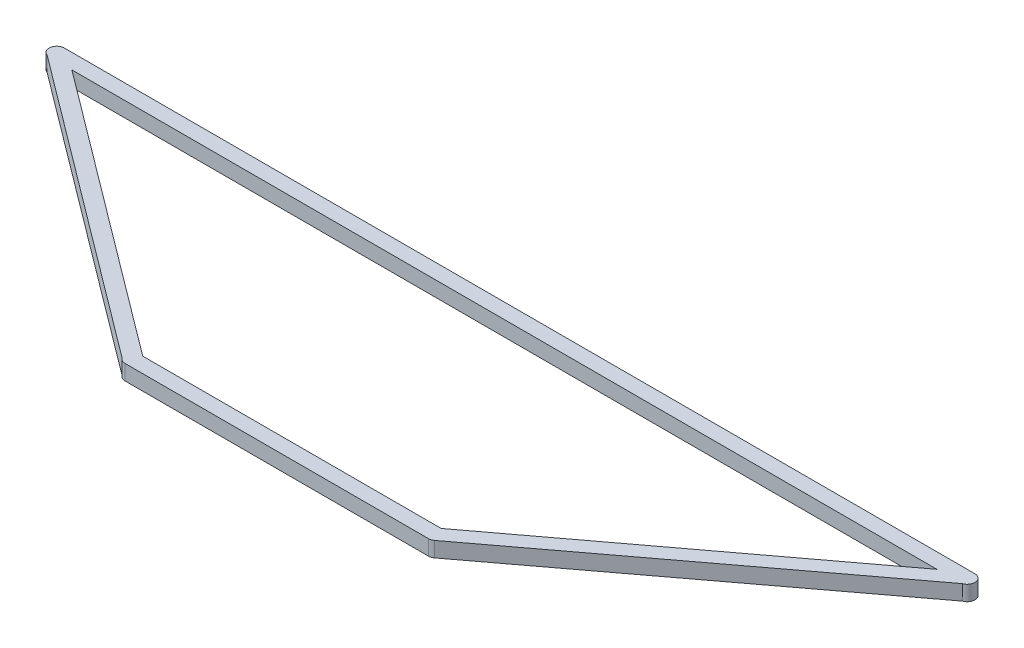
ISO-10303-21;
HEADER;
FILE_DESCRIPTION(('STEP AP214'),'2;1');
FILE_NAME('part.step','',(''),(''),'','','');
FILE_SCHEMA(('AUTOMOTIVE_DESIGN { 1 0 10303 214 1 1 1 1 }'));
ENDSEC;
DATA;
#1=APPLICATION_CONTEXT('core data for automotive mechanical design processes');
#2=APPLICATION_PROTOCOL_DEFINITION('international standard','automotive_design',2000,#1);
#3=PRODUCT_CONTEXT('',#1,'mechanical');
#4=PRODUCT('Part','Part','',(#3));
#5=PRODUCT_RELATED_PRODUCT_CATEGORY('part','',(#4));
#6=PRODUCT_DEFINITION_FORMATION('','',#4);
#7=PRODUCT_DEFINITION_CONTEXT('part definition',#1,'design');
#8=PRODUCT_DEFINITION('design','',#6,#7);
#9=PRODUCT_DEFINITION_SHAPE('','',#8);
#10=(LENGTH_UNIT() NAMED_UNIT(*) SI_UNIT(.MILLI.,.METRE.));
#11=(NAMED_UNIT(*) PLANE_ANGLE_UNIT() SI_UNIT($,.RADIAN.));
#12=(NAMED_UNIT(*) SI_UNIT($,.STERADIAN.) SOLID_ANGLE_UNIT());
#13=UNCERTAINTY_MEASURE_WITH_UNIT(LENGTH_MEASURE(1.E-05),#10,'distance_accuracy_value','');
#14=(GEOMETRIC_REPRESENTATION_CONTEXT(3) GLOBAL_UNCERTAINTY_ASSIGNED_CONTEXT((#13)) GLOBAL_UNIT_ASSIGNED_CONTEXT((#10,
#11,#12)) REPRESENTATION_CONTEXT('',''));
#15=CARTESIAN_POINT('',(0.,0.,0.));
#16=DIRECTION('',(0.,0.,1.));
#17=DIRECTION('',(1.,0.,0.));
#18=AXIS2_PLACEMENT_3D('',#15,#16,#17);
#19=CARTESIAN_POINT('',(0.,0.,0.));
#20=DIRECTION('',(0.,-1.,0.));
#21=DIRECTION('',(0.,0.,-1.));
#22=AXIS2_PLACEMENT_3D('',#19,#20,#21);
#23=PLANE('',#22);
#24=CARTESIAN_POINT('',(705.155705357217,0.,32.4495765055541));
#25=DIRECTION('',(0.,1.,0.));
#26=DIRECTION('',(0.,0.,1.));
#27=AXIS2_PLACEMENT_3D('',#24,#25,#26);
#28=CIRCLE('',#27,10.0000000000001);
#29=CARTESIAN_POINT('',(705.155705357217,0.,42.4495765055542));
#30=VERTEX_POINT('',#29);
#31=CARTESIAN_POINT('',(711.164164436648,0.,40.4432252025388));
#32=VERTEX_POINT('',#31);
#33=EDGE_CURVE('E337',#30,#32,#28,.T.);
#34=ORIENTED_EDGE('',*,*,#33,.F.);
#35=DIRECTION('',(-1.,0.,0.));
#36=VECTOR('',#35,1.);
#37=CARTESIAN_POINT('',(705.155705357217,0.,42.4495765055542));
#38=LINE('',#37,#36);
#39=CARTESIAN_POINT('',(305.155705357217,0.,42.4495765055541));
#40=VERTEX_POINT('',#39);
#41=EDGE_CURVE('E349',#30,#40,#38,.T.);
#42=ORIENTED_EDGE('',*,*,#41,.T.);
#43=CARTESIAN_POINT('',(305.155705357217,0.,32.4495765055541));
#44=DIRECTION('',(0.,1.,0.));
#45=DIRECTION('',(0.,0.,1.));
#46=AXIS2_PLACEMENT_3D('',#43,#44,#45);
#47=CIRCLE('',#46,9.99999999999998);
#48=CARTESIAN_POINT('',(296.899795113956,0.,38.0922661173626));
#49=VERTEX_POINT('',#48);
#50=EDGE_CURVE('E330',#49,#40,#47,.T.);
#51=ORIENTED_EDGE('',*,*,#50,.F.);
#52=DIRECTION('',(-0.8,0.,-0.6));
#53=VECTOR('',#52,1.);
#54=CARTESIAN_POINT('',(302.050378197994,0.,41.9552034303915));
#55=LINE('',#54,#53);
#56=CARTESIAN_POINT('',(-97.9496218020057,0.,-258.044796569608));
#57=VERTEX_POINT('',#56);
#58=EDGE_CURVE('E388',#49,#57,#55,.T.);
#59=ORIENTED_EDGE('',*,*,#58,.T.);
#60=CARTESIAN_POINT('',(-94.844294642783,0.,-267.550423494446));
#61=DIRECTION('',(0.,1.,0.));
#62=DIRECTION('',(0.,0.,1.));
#63=AXIS2_PLACEMENT_3D('',#60,#61,#62);
#64=CIRCLE('',#63,10.);
#65=CARTESIAN_POINT('',(-94.844294642783,0.,-277.550423494446));
#66=VERTEX_POINT('',#65);
#67=EDGE_CURVE('E375',#66,#57,#64,.T.);
#68=ORIENTED_EDGE('',*,*,#67,.F.);
#69=DIRECTION('',(1.,0.,0.));
#70=VECTOR('',#69,1.);
#71=CARTESIAN_POINT('',(-94.844294642783,0.,-277.550423494446));
#72=LINE('',#71,#70);
#73=CARTESIAN_POINT('',(1105.15570535722,0.,-277.550423494446));
#74=VERTEX_POINT('',#73);
#75=EDGE_CURVE('E419',#66,#74,#72,.T.);
#76=ORIENTED_EDGE('',*,*,#75,.T.);
#77=CARTESIAN_POINT('',(1105.15570535722,0.,-267.550423494446));
#78=DIRECTION('',(0.,1.,0.));
#79=DIRECTION('',(0.,0.,1.));
#80=AXIS2_PLACEMENT_3D('',#77,#78,#79);
#81=CIRCLE('',#80,10.0000000000001);
#82=CARTESIAN_POINT('',(1108.28113574632,0.,-258.051387496889));
#83=VERTEX_POINT('',#82);
#84=EDGE_CURVE('E380',#83,#74,#81,.T.);
#85=ORIENTED_EDGE('',*,*,#84,.F.);
#86=DIRECTION('',(-0.799364869698462,0.,0.600845907943094));
#87=VECTOR('',#86,1.);
#88=CARTESIAN_POINT('',(1113.41161560048,0.,-261.907733882638));
#89=LINE('',#88,#87);
#90=EDGE_CURVE('E351',#83,#32,#89,.T.);
#91=ORIENTED_EDGE('',*,*,#90,.T.);
#92=EDGE_LOOP('',(#34,#42,#51,#59,#68,#76,#85,#91));
#93=FACE_BOUND('',#92,.T.);
#94=DIRECTION('',(1.,0.,0.));
#95=VECTOR('',#94,1.);
#96=CARTESIAN_POINT('',(305.155705357217,0.,22.4495765055542));
#97=LINE('',#96,#95);
#98=CARTESIAN_POINT('',(308.48903869055,0.,22.4495765055542));
#99=VERTEX_POINT('',#98);
#100=CARTESIAN_POINT('',(701.822381286113,0.,22.449576505554));
#101=VERTEX_POINT('',#100);
#102=EDGE_CURVE('E360',#99,#101,#97,.T.);
#103=ORIENTED_EDGE('',*,*,#102,.T.);
#104=DIRECTION('',(0.799999993286438,0.,-0.600000008951416));
#105=VECTOR('',#104,1.);
#106=CARTESIAN_POINT('',(699.147246277786,0.,24.4559278085695));
#107=LINE('',#106,#105);
#108=CARTESIAN_POINT('',(1075.15570591668,0.,-257.550423494446));
#109=VERTEX_POINT('',#108);
#110=EDGE_CURVE('E344',#101,#109,#107,.T.);
#111=ORIENTED_EDGE('',*,*,#110,.T.);
#112=DIRECTION('',(-1.,0.,0.));
#113=VECTOR('',#112,1.);
#114=CARTESIAN_POINT('',(1105.15570535722,0.,-257.550423494446));
#115=LINE('',#114,#113);
#116=CARTESIAN_POINT('',(-64.844294642783,0.,-257.550423494446));
#117=VERTEX_POINT('',#116);
#118=EDGE_CURVE('E383',#109,#117,#115,.T.);
#119=ORIENTED_EDGE('',*,*,#118,.T.);
#120=DIRECTION('',(0.8,0.,0.6));
#121=VECTOR('',#120,1.);
#122=CARTESIAN_POINT('',(-88.844294642783,0.,-275.550423494446));
#123=LINE('',#122,#121);
#124=EDGE_CURVE('E417',#117,#99,#123,.T.);
#125=ORIENTED_EDGE('',*,*,#124,.T.);
#126=EDGE_LOOP('',(#103,#111,#119,#125));
#127=FACE_BOUND('',#126,.T.);
#128=ADVANCED_FACE('F251',(#93,#127),#23,.T.);
#129=CARTESIAN_POINT('',(0.,20.,0.));
#130=DIRECTION('',(0.,-1.,0.));
#131=DIRECTION('',(0.,0.,-1.));
#132=AXIS2_PLACEMENT_3D('',#129,#130,#131);
#133=PLANE('',#132);
#134=DIRECTION('',(-1.,0.,0.));
#135=VECTOR('',#134,1.);
#136=CARTESIAN_POINT('',(705.155705357217,20.,42.4495765055542));
#137=LINE('',#136,#135);
#138=CARTESIAN_POINT('',(705.155705357217,20.,42.4495765055542));
#139=VERTEX_POINT('',#138);
#140=CARTESIAN_POINT('',(305.155705357217,20.,42.4495765055541));
#141=VERTEX_POINT('',#140);
#142=EDGE_CURVE('E357',#139,#141,#137,.T.);
#143=ORIENTED_EDGE('',*,*,#142,.F.);
#144=CARTESIAN_POINT('',(705.155705357217,20.,32.4495765055541));
#145=DIRECTION('',(0.,1.,0.));
#146=DIRECTION('',(0.,0.,1.));
#147=AXIS2_PLACEMENT_3D('',#144,#145,#146);
#148=CIRCLE('',#147,10.0000000000001);
#149=CARTESIAN_POINT('',(711.164164436648,20.,40.4432252025388));
#150=VERTEX_POINT('',#149);
#151=EDGE_CURVE('E339',#139,#150,#148,.T.);
#152=ORIENTED_EDGE('',*,*,#151,.T.);
#153=DIRECTION('',(-0.799364869698462,0.,0.600845907943094));
#154=VECTOR('',#153,1.);
#155=CARTESIAN_POINT('',(1113.41161560048,20.,-261.907733882638));
#156=LINE('',#155,#154);
#157=CARTESIAN_POINT('',(1108.28113574632,20.,-258.051387496889));
#158=VERTEX_POINT('',#157);
#159=EDGE_CURVE('E443',#158,#150,#156,.T.);
#160=ORIENTED_EDGE('',*,*,#159,.F.);
#161=CARTESIAN_POINT('',(1105.15570535722,20.,-267.550423494446));
#162=DIRECTION('',(0.,1.,0.));
#163=DIRECTION('',(0.,0.,1.));
#164=AXIS2_PLACEMENT_3D('',#161,#162,#163);
#165=CIRCLE('',#164,10.0000000000001);
#166=CARTESIAN_POINT('',(1105.15570535722,20.,-277.550423494446));
#167=VERTEX_POINT('',#166);
#168=EDGE_CURVE('E373',#158,#167,#165,.T.);
#169=ORIENTED_EDGE('',*,*,#168,.T.);
#170=DIRECTION('',(1.,0.,0.));
#171=VECTOR('',#170,1.);
#172=CARTESIAN_POINT('',(-94.844294642783,20.,-277.550423494446));
#173=LINE('',#172,#171);
#174=CARTESIAN_POINT('',(-94.844294642783,20.,-277.550423494446));
#175=VERTEX_POINT('',#174);
#176=EDGE_CURVE('E429',#175,#167,#173,.T.);
#177=ORIENTED_EDGE('',*,*,#176,.F.);
#178=CARTESIAN_POINT('',(-94.844294642783,20.,-267.550423494446));
#179=DIRECTION('',(0.,1.,0.));
#180=DIRECTION('',(0.,0.,1.));
#181=AXIS2_PLACEMENT_3D('',#178,#179,#180);
#182=CIRCLE('',#181,10.);
#183=CARTESIAN_POINT('',(-97.9496218020057,20.,-258.044796569608));
#184=VERTEX_POINT('',#183);
#185=EDGE_CURVE('E368',#175,#184,#182,.T.);
#186=ORIENTED_EDGE('',*,*,#185,.T.);
#187=DIRECTION('',(-0.8,0.,-0.6));
#188=VECTOR('',#187,1.);
#189=CARTESIAN_POINT('',(302.050378197994,20.,41.9552034303915));
#190=LINE('',#189,#188);
#191=CARTESIAN_POINT('',(296.899795113956,20.,38.0922661173626));
#192=VERTEX_POINT('',#191);
#193=EDGE_CURVE('E422',#192,#184,#190,.T.);
#194=ORIENTED_EDGE('',*,*,#193,.F.);
#195=CARTESIAN_POINT('',(305.155705357217,20.,32.4495765055541));
#196=DIRECTION('',(0.,1.,0.));
#197=DIRECTION('',(0.,0.,1.));
#198=AXIS2_PLACEMENT_3D('',#195,#196,#197);
#199=CIRCLE('',#198,9.99999999999998);
#200=EDGE_CURVE('E354',#192,#141,#199,.T.);
#201=ORIENTED_EDGE('',*,*,#200,.T.);
#202=EDGE_LOOP('',(#143,#152,#160,#169,#177,#186,#194,#201));
#203=FACE_BOUND('',#202,.T.);
#204=DIRECTION('',(0.799999993286438,0.,-0.600000008951416));
#205=VECTOR('',#204,1.);
#206=CARTESIAN_POINT('',(699.147246277786,20.,24.4559278085695));
#207=LINE('',#206,#205);
#208=CARTESIAN_POINT('',(701.822381286113,20.,22.449576505554));
#209=VERTEX_POINT('',#208);
#210=CARTESIAN_POINT('',(1075.15570591668,20.,-257.550423494446));
#211=VERTEX_POINT('',#210);
#212=EDGE_CURVE('E436',#209,#211,#207,.T.);
#213=ORIENTED_EDGE('',*,*,#212,.F.);
#214=DIRECTION('',(1.,0.,0.));
#215=VECTOR('',#214,1.);
#216=CARTESIAN_POINT('',(305.155705357217,20.,22.4495765055542));
#217=LINE('',#216,#215);
#218=CARTESIAN_POINT('',(308.48903869055,20.,22.4495765055542));
#219=VERTEX_POINT('',#218);
#220=EDGE_CURVE('E363',#219,#209,#217,.T.);
#221=ORIENTED_EDGE('',*,*,#220,.F.);
#222=DIRECTION('',(0.8,0.,0.6));
#223=VECTOR('',#222,1.);
#224=CARTESIAN_POINT('',(-88.844294642783,20.,-275.550423494446));
#225=LINE('',#224,#223);
#226=CARTESIAN_POINT('',(-64.844294642783,20.,-257.550423494446));
#227=VERTEX_POINT('',#226);
#228=EDGE_CURVE('E393',#227,#219,#225,.T.);
#229=ORIENTED_EDGE('',*,*,#228,.F.);
#230=DIRECTION('',(-1.,0.,0.));
#231=VECTOR('',#230,1.);
#232=CARTESIAN_POINT('',(1105.15570535722,20.,-257.550423494446));
#233=LINE('',#232,#231);
#234=EDGE_CURVE('E406',#211,#227,#233,.T.);
#235=ORIENTED_EDGE('',*,*,#234,.F.);
#236=EDGE_LOOP('',(#213,#221,#229,#235));
#237=FACE_BOUND('',#236,.T.);
#238=ADVANCED_FACE('F455',(#203,#237),#133,.F.);
#239=CARTESIAN_POINT('',(302.050378197994,20.,41.9552034303915));
#240=DIRECTION('',(-0.6,0.,0.8));
#241=DIRECTION('',(0.8,0.,0.6));
#242=AXIS2_PLACEMENT_3D('',#239,#240,#241);
#243=PLANE('',#242);
#244=ORIENTED_EDGE('',*,*,#193,.T.);
#245=DIRECTION('',(0.,-1.,0.));
#246=VECTOR('',#245,1.);
#247=CARTESIAN_POINT('',(-97.9496218020058,20.,-258.044796569608));
#248=LINE('',#247,#246);
#249=EDGE_CURVE('E12',#184,#57,#248,.T.);
#250=ORIENTED_EDGE('',*,*,#249,.T.);
#251=ORIENTED_EDGE('',*,*,#58,.F.);
#252=DIRECTION('',(0.,-1.,0.));
#253=VECTOR('',#252,1.);
#254=CARTESIAN_POINT('',(296.899795113956,20.,38.0922661173626));
#255=LINE('',#254,#253);
#256=EDGE_CURVE('E262',#49,#192,#255,.F.);
#257=ORIENTED_EDGE('',*,*,#256,.T.);
#258=EDGE_LOOP('',(#244,#250,#251,#257));
#259=FACE_BOUND('',#258,.T.);
#260=ADVANCED_FACE('F452',(#259),#243,.T.);
#261=CARTESIAN_POINT('',(-88.844294642783,20.,-275.550423494446));
#262=DIRECTION('',(0.6,0.,-0.8));
#263=DIRECTION('',(-0.8,0.,-0.6));
#264=AXIS2_PLACEMENT_3D('',#261,#262,#263);
#265=PLANE('',#264);
#266=DIRECTION('',(0.,-1.,0.));
#267=VECTOR('',#266,1.);
#268=CARTESIAN_POINT('',(-64.844294642783,20.,-257.550423494446));
#269=LINE('',#268,#267);
#270=EDGE_CURVE('E260',#227,#117,#269,.T.);
#271=ORIENTED_EDGE('',*,*,#270,.F.);
#272=ORIENTED_EDGE('',*,*,#228,.T.);
#273=DIRECTION('',(0.,1.,0.));
#274=VECTOR('',#273,1.);
#275=CARTESIAN_POINT('',(308.48903869055,20.,22.4495765055542));
#276=LINE('',#275,#274);
#277=EDGE_CURVE('E273',#99,#219,#276,.T.);
#278=ORIENTED_EDGE('',*,*,#277,.F.);
#279=ORIENTED_EDGE('',*,*,#124,.F.);
#280=EDGE_LOOP('',(#271,#272,#278,#279));
#281=FACE_BOUND('',#280,.T.);
#282=ADVANCED_FACE('F418',(#281),#265,.T.);
#283=CARTESIAN_POINT('',(1105.15570535722,20.,-267.550423494446));
#284=DIRECTION('',(0.,-1.,0.));
#285=DIRECTION('',(0.,0.,-1.));
#286=AXIS2_PLACEMENT_3D('',#283,#284,#285);
#287=CYLINDRICAL_SURFACE('',#286,10.0000000000001);
#288=DIRECTION('',(0.,-1.,0.));
#289=VECTOR('',#288,1.);
#290=CARTESIAN_POINT('',(1108.28113574632,20.,-258.051387496889));
#291=LINE('',#290,#289);
#292=EDGE_CURVE('E379',#83,#158,#291,.F.);
#293=ORIENTED_EDGE('',*,*,#292,.F.);
#294=ORIENTED_EDGE('',*,*,#84,.T.);
#295=DIRECTION('',(0.,-1.,0.));
#296=VECTOR('',#295,1.);
#297=CARTESIAN_POINT('',(1105.15570535722,20.,-277.550423494446));
#298=LINE('',#297,#296);
#299=EDGE_CURVE('E389',#167,#74,#298,.T.);
#300=ORIENTED_EDGE('',*,*,#299,.F.);
#301=ORIENTED_EDGE('',*,*,#168,.F.);
#302=EDGE_LOOP('',(#293,#294,#300,#301));
#303=FACE_BOUND('',#302,.T.);
#304=ADVANCED_FACE('F257',(#303),#287,.T.);
#305=CARTESIAN_POINT('',(1113.41161560048,20.,-261.907733882638));
#306=DIRECTION('',(0.600845907943094,0.,0.799364869698462));
#307=DIRECTION('',(0.799364869698462,0.,-0.600845907943094));
#308=AXIS2_PLACEMENT_3D('',#305,#306,#307);
#309=PLANE('',#308);
#310=ORIENTED_EDGE('',*,*,#90,.F.);
#311=ORIENTED_EDGE('',*,*,#292,.T.);
#312=ORIENTED_EDGE('',*,*,#159,.T.);
#313=DIRECTION('',(0.,-1.,0.));
#314=VECTOR('',#313,1.);
#315=CARTESIAN_POINT('',(711.164164436648,20.,40.4432252025388));
#316=LINE('',#315,#314);
#317=EDGE_CURVE('E385',#150,#32,#316,.T.);
#318=ORIENTED_EDGE('',*,*,#317,.T.);
#319=EDGE_LOOP('',(#310,#311,#312,#318));
#320=FACE_BOUND('',#319,.T.);
#321=ADVANCED_FACE('F477',(#320),#309,.T.);
#322=CARTESIAN_POINT('',(705.155705357217,20.,32.4495765055541));
#323=DIRECTION('',(0.,-1.,0.));
#324=DIRECTION('',(0.,0.,-1.));
#325=AXIS2_PLACEMENT_3D('',#322,#323,#324);
#326=CYLINDRICAL_SURFACE('',#325,10.0000000000001);
#327=ORIENTED_EDGE('',*,*,#33,.T.);
#328=ORIENTED_EDGE('',*,*,#317,.F.);
#329=ORIENTED_EDGE('',*,*,#151,.F.);
#330=DIRECTION('',(0.,-1.,0.));
#331=VECTOR('',#330,1.);
#332=CARTESIAN_POINT('',(705.155705357217,20.,42.4495765055542));
#333=LINE('',#332,#331);
#334=EDGE_CURVE('E333',#139,#30,#333,.T.);
#335=ORIENTED_EDGE('',*,*,#334,.T.);
#336=EDGE_LOOP('',(#327,#328,#329,#335));
#337=FACE_BOUND('',#336,.T.);
#338=ADVANCED_FACE('F331',(#337),#326,.T.);
#339=CARTESIAN_POINT('',(699.147246277786,20.,24.4559278085695));
#340=DIRECTION('',(-0.600000008951416,0.,-0.799999993286438));
#341=DIRECTION('',(-0.799999993286438,0.,0.600000008951416));
#342=AXIS2_PLACEMENT_3D('',#339,#340,#341);
#343=PLANE('',#342);
#344=ORIENTED_EDGE('',*,*,#212,.T.);
#345=DIRECTION('',(0.,-1.,0.));
#346=VECTOR('',#345,1.);
#347=CARTESIAN_POINT('',(1075.15570591668,20.,-257.550423494446));
#348=LINE('',#347,#346);
#349=EDGE_CURVE('E387',#211,#109,#348,.T.);
#350=ORIENTED_EDGE('',*,*,#349,.T.);
#351=ORIENTED_EDGE('',*,*,#110,.F.);
#352=DIRECTION('',(0.,-1.,0.));
#353=VECTOR('',#352,1.);
#354=CARTESIAN_POINT('',(701.822381286113,20.,22.449576505554));
#355=LINE('',#354,#353);
#356=EDGE_CURVE('E382',#209,#101,#355,.T.);
#357=ORIENTED_EDGE('',*,*,#356,.F.);
#358=EDGE_LOOP('',(#344,#350,#351,#357));
#359=FACE_BOUND('',#358,.T.);
#360=ADVANCED_FACE('F451',(#359),#343,.T.);
#361=CARTESIAN_POINT('',(705.155705357217,20.,42.4495765055542));
#362=DIRECTION('',(0.,0.,1.));
#363=DIRECTION('',(1.,0.,0.));
#364=AXIS2_PLACEMENT_3D('',#361,#362,#363);
#365=PLANE('',#364);
#366=ORIENTED_EDGE('',*,*,#41,.F.);
#367=ORIENTED_EDGE('',*,*,#334,.F.);
#368=ORIENTED_EDGE('',*,*,#142,.T.);
#369=DIRECTION('',(0.,-1.,0.));
#370=VECTOR('',#369,1.);
#371=CARTESIAN_POINT('',(305.155705357217,20.,42.4495765055541));
#372=LINE('',#371,#370);
#373=EDGE_CURVE('E341',#141,#40,#372,.T.);
#374=ORIENTED_EDGE('',*,*,#373,.T.);
#375=EDGE_LOOP('',(#366,#367,#368,#374));
#376=FACE_BOUND('',#375,.T.);
#377=ADVANCED_FACE('F356',(#376),#365,.T.);
#378=CARTESIAN_POINT('',(305.155705357217,20.,22.4495765055542));
#379=DIRECTION('',(0.,0.,-1.));
#380=DIRECTION('',(-1.,0.,0.));
#381=AXIS2_PLACEMENT_3D('',#378,#379,#380);
#382=PLANE('',#381);
#383=ORIENTED_EDGE('',*,*,#102,.F.);
#384=ORIENTED_EDGE('',*,*,#277,.T.);
#385=ORIENTED_EDGE('',*,*,#220,.T.);
#386=ORIENTED_EDGE('',*,*,#356,.T.);
#387=EDGE_LOOP('',(#383,#384,#385,#386));
#388=FACE_BOUND('',#387,.T.);
#389=ADVANCED_FACE('F450',(#388),#382,.T.);
#390=CARTESIAN_POINT('',(1105.15570535722,20.,-257.550423494446));
#391=DIRECTION('',(0.,0.,1.));
#392=DIRECTION('',(1.,0.,0.));
#393=AXIS2_PLACEMENT_3D('',#390,#391,#392);
#394=PLANE('',#393);
#395=ORIENTED_EDGE('',*,*,#234,.T.);
#396=ORIENTED_EDGE('',*,*,#270,.T.);
#397=ORIENTED_EDGE('',*,*,#118,.F.);
#398=ORIENTED_EDGE('',*,*,#349,.F.);
#399=EDGE_LOOP('',(#395,#396,#397,#398));
#400=FACE_BOUND('',#399,.T.);
#401=ADVANCED_FACE('F402',(#400),#394,.T.);
#402=CARTESIAN_POINT('',(-94.844294642783,20.,-277.550423494446));
#403=DIRECTION('',(0.,0.,-1.));
#404=DIRECTION('',(-1.,0.,0.));
#405=AXIS2_PLACEMENT_3D('',#402,#403,#404);
#406=PLANE('',#405);
#407=ORIENTED_EDGE('',*,*,#75,.F.);
#408=DIRECTION('',(0.,-1.,0.));
#409=VECTOR('',#408,1.);
#410=CARTESIAN_POINT('',(-94.844294642783,20.,-277.550423494446));
#411=LINE('',#410,#409);
#412=EDGE_CURVE('E432',#175,#66,#411,.T.);
#413=ORIENTED_EDGE('',*,*,#412,.F.);
#414=ORIENTED_EDGE('',*,*,#176,.T.);
#415=ORIENTED_EDGE('',*,*,#299,.T.);
#416=EDGE_LOOP('',(#407,#413,#414,#415));
#417=FACE_BOUND('',#416,.T.);
#418=ADVANCED_FACE('F466',(#417),#406,.T.);
#419=CARTESIAN_POINT('',(305.155705357217,20.,32.4495765055541));
#420=DIRECTION('',(0.,-1.,0.));
#421=DIRECTION('',(0.,0.,-1.));
#422=AXIS2_PLACEMENT_3D('',#419,#420,#421);
#423=CYLINDRICAL_SURFACE('',#422,9.99999999999998);
#424=ORIENTED_EDGE('',*,*,#256,.F.);
#425=ORIENTED_EDGE('',*,*,#50,.T.);
#426=ORIENTED_EDGE('',*,*,#373,.F.);
#427=ORIENTED_EDGE('',*,*,#200,.F.);
#428=EDGE_LOOP('',(#424,#425,#426,#427));
#429=FACE_BOUND('',#428,.T.);
#430=ADVANCED_FACE('F463',(#429),#423,.T.);
#431=CARTESIAN_POINT('',(-94.844294642783,20.,-267.550423494446));
#432=DIRECTION('',(0.,-1.,0.));
#433=DIRECTION('',(0.,0.,-1.));
#434=AXIS2_PLACEMENT_3D('',#431,#432,#433);
#435=CYLINDRICAL_SURFACE('',#434,10.);
#436=ORIENTED_EDGE('',*,*,#249,.F.);
#437=ORIENTED_EDGE('',*,*,#185,.F.);
#438=ORIENTED_EDGE('',*,*,#412,.T.);
#439=ORIENTED_EDGE('',*,*,#67,.T.);
#440=EDGE_LOOP('',(#436,#437,#438,#439));
#441=FACE_BOUND('',#440,.T.);
#442=ADVANCED_FACE('F460',(#441),#435,.T.);
#443=CLOSED_SHELL('',(#128,#238,#260,#282,#304,#321,#338,#360,#377,#389,#401,#418,#430,#442));
#444=MANIFOLD_SOLID_BREP('B2',#443);
#445=ADVANCED_BREP_SHAPE_REPRESENTATION('',(#18,#444),#14);
#446=SHAPE_DEFINITION_REPRESENTATION(#9,#445);
ENDSEC;
END-ISO-10303-21;
